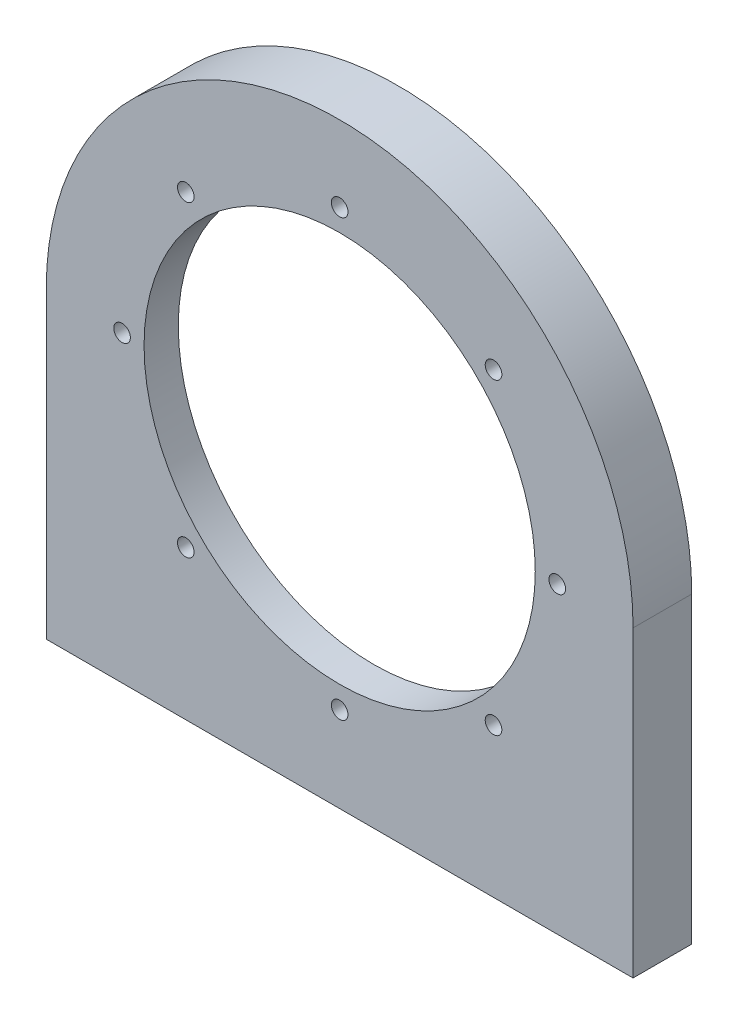
ISO-10303-21;
HEADER;
FILE_DESCRIPTION(('STEP AP214'),'2;1');
FILE_NAME('part.step','',(''),(''),'','','');
FILE_SCHEMA(('AUTOMOTIVE_DESIGN { 1 0 10303 214 1 1 1 1 }'));
ENDSEC;
DATA;
#1=APPLICATION_CONTEXT('core data for automotive mechanical design processes');
#2=APPLICATION_PROTOCOL_DEFINITION('international standard','automotive_design',2000,#1);
#3=PRODUCT_CONTEXT('',#1,'mechanical');
#4=PRODUCT('Part','Part','',(#3));
#5=PRODUCT_RELATED_PRODUCT_CATEGORY('part','',(#4));
#6=PRODUCT_DEFINITION_FORMATION('','',#4);
#7=PRODUCT_DEFINITION_CONTEXT('part definition',#1,'design');
#8=PRODUCT_DEFINITION('design','',#6,#7);
#9=PRODUCT_DEFINITION_SHAPE('','',#8);
#10=(LENGTH_UNIT() NAMED_UNIT(*) SI_UNIT(.MILLI.,.METRE.));
#11=(NAMED_UNIT(*) PLANE_ANGLE_UNIT() SI_UNIT($,.RADIAN.));
#12=(NAMED_UNIT(*) SI_UNIT($,.STERADIAN.) SOLID_ANGLE_UNIT());
#13=UNCERTAINTY_MEASURE_WITH_UNIT(LENGTH_MEASURE(1.E-05),#10,'distance_accuracy_value','');
#14=(GEOMETRIC_REPRESENTATION_CONTEXT(3) GLOBAL_UNCERTAINTY_ASSIGNED_CONTEXT((#13)) GLOBAL_UNIT_ASSIGNED_CONTEXT((#10,
#11,#12)) REPRESENTATION_CONTEXT('',''));
#15=CARTESIAN_POINT('',(0.,0.,0.));
#16=DIRECTION('',(0.,0.,1.));
#17=DIRECTION('',(1.,0.,0.));
#18=AXIS2_PLACEMENT_3D('',#15,#16,#17);
#19=CARTESIAN_POINT('',(0.,0.,7.));
#20=DIRECTION('',(0.,0.,-1.));
#21=DIRECTION('',(-1.,0.,0.));
#22=AXIS2_PLACEMENT_3D('',#19,#20,#21);
#23=CYLINDRICAL_SURFACE('',#22,60.);
#24=DIRECTION('',(0.,0.,1.));
#25=VECTOR('',#24,1.);
#26=CARTESIAN_POINT('',(-60.,0.,-140.070352039224));
#27=LINE('',#26,#25);
#28=CARTESIAN_POINT('',(-60.,0.,-5.));
#29=VERTEX_POINT('',#28);
#30=CARTESIAN_POINT('',(-60.,0.,7.));
#31=VERTEX_POINT('',#30);
#32=EDGE_CURVE('E60',#29,#31,#27,.T.);
#33=ORIENTED_EDGE('',*,*,#32,.T.);
#34=CARTESIAN_POINT('',(0.,0.,7.));
#35=DIRECTION('',(0.,0.,1.));
#36=DIRECTION('',(1.,0.,0.));
#37=AXIS2_PLACEMENT_3D('',#34,#35,#36);
#38=CIRCLE('',#37,60.);
#39=CARTESIAN_POINT('',(60.,0.,7.));
#40=VERTEX_POINT('',#39);
#41=EDGE_CURVE('E11',#40,#31,#38,.T.);
#42=ORIENTED_EDGE('',*,*,#41,.F.);
#43=DIRECTION('',(0.,0.,1.));
#44=VECTOR('',#43,1.);
#45=CARTESIAN_POINT('',(60.,0.,-140.070352039224));
#46=LINE('',#45,#44);
#47=CARTESIAN_POINT('',(60.,0.,-5.));
#48=VERTEX_POINT('',#47);
#49=EDGE_CURVE('E112',#48,#40,#46,.T.);
#50=ORIENTED_EDGE('',*,*,#49,.F.);
#51=CARTESIAN_POINT('',(0.,0.,-5.));
#52=DIRECTION('',(0.,0.,-1.));
#53=DIRECTION('',(-1.,0.,0.));
#54=AXIS2_PLACEMENT_3D('',#51,#52,#53);
#55=CIRCLE('',#54,60.);
#56=EDGE_CURVE('E140',#29,#48,#55,.T.);
#57=ORIENTED_EDGE('',*,*,#56,.F.);
#58=EDGE_LOOP('',(#33,#42,#50,#57));
#59=FACE_BOUND('',#58,.T.);
#60=ADVANCED_FACE('F45',(#59),#23,.T.);
#61=CARTESIAN_POINT('',(0.,0.,0.));
#62=DIRECTION('',(0.,0.,1.));
#63=DIRECTION('',(1.,0.,0.));
#64=AXIS2_PLACEMENT_3D('',#61,#62,#63);
#65=PLANE('',#64);
#66=CARTESIAN_POINT('',(0.,0.,0.));
#67=DIRECTION('',(0.,0.,1.));
#68=DIRECTION('',(1.,0.,0.));
#69=AXIS2_PLACEMENT_3D('',#66,#67,#68);
#70=CIRCLE('',#69,40.);
#71=CARTESIAN_POINT('',(40.,0.,0.));
#72=VERTEX_POINT('',#71);
#73=EDGE_CURVE('E210',#72,#72,#70,.T.);
#74=ORIENTED_EDGE('',*,*,#73,.T.);
#75=EDGE_LOOP('',(#74));
#76=FACE_BOUND('',#75,.T.);
#77=CARTESIAN_POINT('',(-31.4662517628008,31.4662517628,0.));
#78=DIRECTION('',(0.,0.,1.));
#79=DIRECTION('',(1.,0.,0.));
#80=AXIS2_PLACEMENT_3D('',#77,#78,#79);
#81=CIRCLE('',#80,1.7);
#82=CARTESIAN_POINT('',(-29.7662517628008,31.4662517628,0.));
#83=VERTEX_POINT('',#82);
#84=EDGE_CURVE('E206',#83,#83,#81,.T.);
#85=ORIENTED_EDGE('',*,*,#84,.T.);
#86=EDGE_LOOP('',(#85));
#87=FACE_BOUND('',#86,.T.);
#88=CARTESIAN_POINT('',(-44.4999999999981,-1.89442426535137E-12,0.));
#89=DIRECTION('',(0.,0.,1.));
#90=DIRECTION('',(1.,0.,0.));
#91=AXIS2_PLACEMENT_3D('',#88,#89,#90);
#92=CIRCLE('',#91,1.7);
#93=CARTESIAN_POINT('',(-42.7999999999981,-1.89442426535137E-12,0.));
#94=VERTEX_POINT('',#93);
#95=EDGE_CURVE('E198',#94,#94,#92,.T.);
#96=ORIENTED_EDGE('',*,*,#95,.T.);
#97=EDGE_LOOP('',(#96));
#98=FACE_BOUND('',#97,.T.);
#99=CARTESIAN_POINT('',(-31.4662517627981,-31.4662517628027,0.));
#100=DIRECTION('',(0.,0.,1.));
#101=DIRECTION('',(1.,0.,0.));
#102=AXIS2_PLACEMENT_3D('',#99,#100,#101);
#103=CIRCLE('',#102,1.7);
#104=CARTESIAN_POINT('',(-29.7662517627981,-31.4662517628027,0.));
#105=VERTEX_POINT('',#104);
#106=EDGE_CURVE('E190',#105,#105,#103,.T.);
#107=ORIENTED_EDGE('',*,*,#106,.T.);
#108=EDGE_LOOP('',(#107));
#109=FACE_BOUND('',#108,.T.);
#110=CARTESIAN_POINT('',(3.77794917419032E-12,-44.5,0.));
#111=DIRECTION('',(0.,0.,1.));
#112=DIRECTION('',(1.,0.,0.));
#113=AXIS2_PLACEMENT_3D('',#110,#111,#112);
#114=CIRCLE('',#113,1.7);
#115=CARTESIAN_POINT('',(1.70000000000378,-44.5,0.));
#116=VERTEX_POINT('',#115);
#117=EDGE_CURVE('E182',#116,#116,#114,.T.);
#118=ORIENTED_EDGE('',*,*,#117,.T.);
#119=EDGE_LOOP('',(#118));
#120=FACE_BOUND('',#119,.T.);
#121=CARTESIAN_POINT('',(31.4662517628046,-31.4662517628,0.));
#122=DIRECTION('',(0.,0.,1.));
#123=DIRECTION('',(1.,0.,0.));
#124=AXIS2_PLACEMENT_3D('',#121,#122,#123);
#125=CIRCLE('',#124,1.7);
#126=CARTESIAN_POINT('',(33.1662517628046,-31.4662517628,0.));
#127=VERTEX_POINT('',#126);
#128=EDGE_CURVE('E174',#127,#127,#125,.T.);
#129=ORIENTED_EDGE('',*,*,#128,.T.);
#130=EDGE_LOOP('',(#129));
#131=FACE_BOUND('',#130,.T.);
#132=CARTESIAN_POINT('',(44.5000000000019,1.88897458709516E-12,0.));
#133=DIRECTION('',(0.,0.,1.));
#134=DIRECTION('',(1.,0.,0.));
#135=AXIS2_PLACEMENT_3D('',#132,#133,#134);
#136=CIRCLE('',#135,1.7);
#137=CARTESIAN_POINT('',(46.2000000000019,1.88897458709516E-12,0.));
#138=VERTEX_POINT('',#137);
#139=EDGE_CURVE('E166',#138,#138,#136,.T.);
#140=ORIENTED_EDGE('',*,*,#139,.T.);
#141=EDGE_LOOP('',(#140));
#142=FACE_BOUND('',#141,.T.);
#143=CARTESIAN_POINT('',(31.4662517628019,31.4662517628027,0.));
#144=DIRECTION('',(0.,0.,1.));
#145=DIRECTION('',(1.,0.,0.));
#146=AXIS2_PLACEMENT_3D('',#143,#144,#145);
#147=CIRCLE('',#146,1.7);
#148=CARTESIAN_POINT('',(33.1662517628019,31.4662517628027,0.));
#149=VERTEX_POINT('',#148);
#150=EDGE_CURVE('E158',#149,#149,#147,.T.);
#151=ORIENTED_EDGE('',*,*,#150,.T.);
#152=EDGE_LOOP('',(#151));
#153=FACE_BOUND('',#152,.T.);
#154=CARTESIAN_POINT('',(0.,44.5,0.));
#155=DIRECTION('',(0.,0.,1.));
#156=DIRECTION('',(1.,0.,0.));
#157=AXIS2_PLACEMENT_3D('',#154,#155,#156);
#158=CIRCLE('',#157,1.7);
#159=CARTESIAN_POINT('',(1.7,44.5,0.));
#160=VERTEX_POINT('',#159);
#161=EDGE_CURVE('E150',#160,#160,#158,.T.);
#162=ORIENTED_EDGE('',*,*,#161,.T.);
#163=EDGE_LOOP('',(#162));
#164=FACE_BOUND('',#163,.T.);
#165=CARTESIAN_POINT('',(0.,0.,0.));
#166=DIRECTION('',(0.,0.,-1.));
#167=DIRECTION('',(-1.,0.,0.));
#168=AXIS2_PLACEMENT_3D('',#165,#166,#167);
#169=CIRCLE('',#168,50.);
#170=CARTESIAN_POINT('',(-50.,0.,0.));
#171=VERTEX_POINT('',#170);
#172=EDGE_CURVE('E135',#171,#171,#169,.T.);
#173=ORIENTED_EDGE('',*,*,#172,.T.);
#174=EDGE_LOOP('',(#173));
#175=FACE_BOUND('',#174,.T.);
#176=ADVANCED_FACE('F217',(#76,#87,#98,#109,#120,#131,#142,#153,#164,#175),#65,.F.);
#177=CARTESIAN_POINT('',(0.,0.,7.));
#178=DIRECTION('',(0.,0.,1.));
#179=DIRECTION('',(1.,0.,0.));
#180=AXIS2_PLACEMENT_3D('',#177,#178,#179);
#181=PLANE('',#180);
#182=CARTESIAN_POINT('',(0.,44.5,7.));
#183=DIRECTION('',(0.,0.,1.));
#184=DIRECTION('',(1.,0.,0.));
#185=AXIS2_PLACEMENT_3D('',#182,#183,#184);
#186=CIRCLE('',#185,1.7);
#187=CARTESIAN_POINT('',(1.7,44.5,7.));
#188=VERTEX_POINT('',#187);
#189=EDGE_CURVE('E146',#188,#188,#186,.T.);
#190=ORIENTED_EDGE('',*,*,#189,.F.);
#191=EDGE_LOOP('',(#190));
#192=FACE_BOUND('',#191,.T.);
#193=CARTESIAN_POINT('',(31.4662517628019,31.4662517628027,7.));
#194=DIRECTION('',(0.,0.,1.));
#195=DIRECTION('',(1.,0.,0.));
#196=AXIS2_PLACEMENT_3D('',#193,#194,#195);
#197=CIRCLE('',#196,1.7);
#198=CARTESIAN_POINT('',(33.1662517628019,31.4662517628027,7.));
#199=VERTEX_POINT('',#198);
#200=EDGE_CURVE('E154',#199,#199,#197,.T.);
#201=ORIENTED_EDGE('',*,*,#200,.F.);
#202=EDGE_LOOP('',(#201));
#203=FACE_BOUND('',#202,.T.);
#204=CARTESIAN_POINT('',(44.5000000000019,1.88897458709516E-12,7.));
#205=DIRECTION('',(0.,0.,1.));
#206=DIRECTION('',(1.,0.,0.));
#207=AXIS2_PLACEMENT_3D('',#204,#205,#206);
#208=CIRCLE('',#207,1.7);
#209=CARTESIAN_POINT('',(46.2000000000019,1.88897458709516E-12,7.));
#210=VERTEX_POINT('',#209);
#211=EDGE_CURVE('E162',#210,#210,#208,.T.);
#212=ORIENTED_EDGE('',*,*,#211,.F.);
#213=EDGE_LOOP('',(#212));
#214=FACE_BOUND('',#213,.T.);
#215=CARTESIAN_POINT('',(31.4662517628046,-31.4662517628,7.));
#216=DIRECTION('',(0.,0.,1.));
#217=DIRECTION('',(1.,0.,0.));
#218=AXIS2_PLACEMENT_3D('',#215,#216,#217);
#219=CIRCLE('',#218,1.7);
#220=CARTESIAN_POINT('',(33.1662517628046,-31.4662517628,7.));
#221=VERTEX_POINT('',#220);
#222=EDGE_CURVE('E170',#221,#221,#219,.T.);
#223=ORIENTED_EDGE('',*,*,#222,.F.);
#224=EDGE_LOOP('',(#223));
#225=FACE_BOUND('',#224,.T.);
#226=CARTESIAN_POINT('',(3.77794917419032E-12,-44.5,7.));
#227=DIRECTION('',(0.,0.,1.));
#228=DIRECTION('',(1.,0.,0.));
#229=AXIS2_PLACEMENT_3D('',#226,#227,#228);
#230=CIRCLE('',#229,1.7);
#231=CARTESIAN_POINT('',(1.70000000000378,-44.5,7.));
#232=VERTEX_POINT('',#231);
#233=EDGE_CURVE('E178',#232,#232,#230,.T.);
#234=ORIENTED_EDGE('',*,*,#233,.F.);
#235=EDGE_LOOP('',(#234));
#236=FACE_BOUND('',#235,.T.);
#237=CARTESIAN_POINT('',(-31.4662517627981,-31.4662517628027,7.));
#238=DIRECTION('',(0.,0.,1.));
#239=DIRECTION('',(1.,0.,0.));
#240=AXIS2_PLACEMENT_3D('',#237,#238,#239);
#241=CIRCLE('',#240,1.7);
#242=CARTESIAN_POINT('',(-29.7662517627981,-31.4662517628027,7.));
#243=VERTEX_POINT('',#242);
#244=EDGE_CURVE('E186',#243,#243,#241,.T.);
#245=ORIENTED_EDGE('',*,*,#244,.F.);
#246=EDGE_LOOP('',(#245));
#247=FACE_BOUND('',#246,.T.);
#248=CARTESIAN_POINT('',(-44.4999999999981,-1.89442426535137E-12,7.));
#249=DIRECTION('',(0.,0.,1.));
#250=DIRECTION('',(1.,0.,0.));
#251=AXIS2_PLACEMENT_3D('',#248,#249,#250);
#252=CIRCLE('',#251,1.7);
#253=CARTESIAN_POINT('',(-42.7999999999981,-1.89442426535137E-12,7.));
#254=VERTEX_POINT('',#253);
#255=EDGE_CURVE('E194',#254,#254,#252,.T.);
#256=ORIENTED_EDGE('',*,*,#255,.F.);
#257=EDGE_LOOP('',(#256));
#258=FACE_BOUND('',#257,.T.);
#259=CARTESIAN_POINT('',(-31.4662517628008,31.4662517628,7.));
#260=DIRECTION('',(0.,0.,1.));
#261=DIRECTION('',(1.,0.,0.));
#262=AXIS2_PLACEMENT_3D('',#259,#260,#261);
#263=CIRCLE('',#262,1.7);
#264=CARTESIAN_POINT('',(-29.7662517628008,31.4662517628,7.));
#265=VERTEX_POINT('',#264);
#266=EDGE_CURVE('E202',#265,#265,#263,.T.);
#267=ORIENTED_EDGE('',*,*,#266,.F.);
#268=EDGE_LOOP('',(#267));
#269=FACE_BOUND('',#268,.T.);
#270=ORIENTED_EDGE('',*,*,#41,.T.);
#271=DIRECTION('',(0.,-1.,0.));
#272=VECTOR('',#271,1.);
#273=CARTESIAN_POINT('',(-60.,0.,7.));
#274=LINE('',#273,#272);
#275=CARTESIAN_POINT('',(-60.,-62.,7.));
#276=VERTEX_POINT('',#275);
#277=EDGE_CURVE('E66',#31,#276,#274,.T.);
#278=ORIENTED_EDGE('',*,*,#277,.T.);
#279=DIRECTION('',(1.,0.,0.));
#280=VECTOR('',#279,1.);
#281=CARTESIAN_POINT('',(-60.,-62.,7.));
#282=LINE('',#281,#280);
#283=CARTESIAN_POINT('',(60.,-62.,7.));
#284=VERTEX_POINT('',#283);
#285=EDGE_CURVE('E97',#276,#284,#282,.T.);
#286=ORIENTED_EDGE('',*,*,#285,.T.);
#287=DIRECTION('',(0.,1.,0.));
#288=VECTOR('',#287,1.);
#289=CARTESIAN_POINT('',(60.,-62.,7.));
#290=LINE('',#289,#288);
#291=EDGE_CURVE('E106',#284,#40,#290,.T.);
#292=ORIENTED_EDGE('',*,*,#291,.T.);
#293=EDGE_LOOP('',(#270,#278,#286,#292));
#294=FACE_BOUND('',#293,.T.);
#295=CARTESIAN_POINT('',(0.,0.,7.));
#296=DIRECTION('',(0.,0.,1.));
#297=DIRECTION('',(1.,0.,0.));
#298=AXIS2_PLACEMENT_3D('',#295,#296,#297);
#299=CIRCLE('',#298,40.);
#300=CARTESIAN_POINT('',(40.,0.,7.));
#301=VERTEX_POINT('',#300);
#302=EDGE_CURVE('E53',#301,#301,#299,.T.);
#303=ORIENTED_EDGE('',*,*,#302,.F.);
#304=EDGE_LOOP('',(#303));
#305=FACE_BOUND('',#304,.T.);
#306=ADVANCED_FACE('F104',(#192,#203,#214,#225,#236,#247,#258,#269,#294,#305),#181,.T.);
#307=CARTESIAN_POINT('',(0.,0.,7.));
#308=DIRECTION('',(0.,0.,-1.));
#309=DIRECTION('',(-1.,0.,0.));
#310=AXIS2_PLACEMENT_3D('',#307,#308,#309);
#311=CYLINDRICAL_SURFACE('',#310,40.);
#312=ORIENTED_EDGE('',*,*,#302,.T.);
#313=EDGE_LOOP('',(#312));
#314=FACE_BOUND('',#313,.T.);
#315=ORIENTED_EDGE('',*,*,#73,.F.);
#316=EDGE_LOOP('',(#315));
#317=FACE_BOUND('',#316,.T.);
#318=ADVANCED_FACE('F220',(#314,#317),#311,.F.);
#319=CARTESIAN_POINT('',(-31.4662517628008,31.4662517628,7.));
#320=DIRECTION('',(0.,0.,1.));
#321=DIRECTION('',(1.,0.,0.));
#322=AXIS2_PLACEMENT_3D('',#319,#320,#321);
#323=CYLINDRICAL_SURFACE('',#322,1.7);
#324=ORIENTED_EDGE('',*,*,#84,.F.);
#325=EDGE_LOOP('',(#324));
#326=FACE_BOUND('',#325,.T.);
#327=ORIENTED_EDGE('',*,*,#266,.T.);
#328=EDGE_LOOP('',(#327));
#329=FACE_BOUND('',#328,.T.);
#330=ADVANCED_FACE('F222',(#326,#329),#323,.F.);
#331=CARTESIAN_POINT('',(-44.4999999999981,-1.89442426535137E-12,7.));
#332=DIRECTION('',(0.,0.,1.));
#333=DIRECTION('',(1.,0.,0.));
#334=AXIS2_PLACEMENT_3D('',#331,#332,#333);
#335=CYLINDRICAL_SURFACE('',#334,1.7);
#336=ORIENTED_EDGE('',*,*,#95,.F.);
#337=EDGE_LOOP('',(#336));
#338=FACE_BOUND('',#337,.T.);
#339=ORIENTED_EDGE('',*,*,#255,.T.);
#340=EDGE_LOOP('',(#339));
#341=FACE_BOUND('',#340,.T.);
#342=ADVANCED_FACE('F228',(#338,#341),#335,.F.);
#343=CARTESIAN_POINT('',(-31.4662517627981,-31.4662517628027,7.));
#344=DIRECTION('',(0.,0.,1.));
#345=DIRECTION('',(1.,0.,0.));
#346=AXIS2_PLACEMENT_3D('',#343,#344,#345);
#347=CYLINDRICAL_SURFACE('',#346,1.7);
#348=ORIENTED_EDGE('',*,*,#106,.F.);
#349=EDGE_LOOP('',(#348));
#350=FACE_BOUND('',#349,.T.);
#351=ORIENTED_EDGE('',*,*,#244,.T.);
#352=EDGE_LOOP('',(#351));
#353=FACE_BOUND('',#352,.T.);
#354=ADVANCED_FACE('F278',(#350,#353),#347,.F.);
#355=CARTESIAN_POINT('',(3.77794917419032E-12,-44.5,7.));
#356=DIRECTION('',(0.,0.,1.));
#357=DIRECTION('',(1.,0.,0.));
#358=AXIS2_PLACEMENT_3D('',#355,#356,#357);
#359=CYLINDRICAL_SURFACE('',#358,1.7);
#360=ORIENTED_EDGE('',*,*,#117,.F.);
#361=EDGE_LOOP('',(#360));
#362=FACE_BOUND('',#361,.T.);
#363=ORIENTED_EDGE('',*,*,#233,.T.);
#364=EDGE_LOOP('',(#363));
#365=FACE_BOUND('',#364,.T.);
#366=ADVANCED_FACE('F274',(#362,#365),#359,.F.);
#367=CARTESIAN_POINT('',(31.4662517628046,-31.4662517628,7.));
#368=DIRECTION('',(0.,0.,1.));
#369=DIRECTION('',(1.,0.,0.));
#370=AXIS2_PLACEMENT_3D('',#367,#368,#369);
#371=CYLINDRICAL_SURFACE('',#370,1.7);
#372=ORIENTED_EDGE('',*,*,#128,.F.);
#373=EDGE_LOOP('',(#372));
#374=FACE_BOUND('',#373,.T.);
#375=ORIENTED_EDGE('',*,*,#222,.T.);
#376=EDGE_LOOP('',(#375));
#377=FACE_BOUND('',#376,.T.);
#378=ADVANCED_FACE('F270',(#374,#377),#371,.F.);
#379=CARTESIAN_POINT('',(44.5000000000019,1.88897458709516E-12,7.));
#380=DIRECTION('',(0.,0.,1.));
#381=DIRECTION('',(1.,0.,0.));
#382=AXIS2_PLACEMENT_3D('',#379,#380,#381);
#383=CYLINDRICAL_SURFACE('',#382,1.7);
#384=ORIENTED_EDGE('',*,*,#139,.F.);
#385=EDGE_LOOP('',(#384));
#386=FACE_BOUND('',#385,.T.);
#387=ORIENTED_EDGE('',*,*,#211,.T.);
#388=EDGE_LOOP('',(#387));
#389=FACE_BOUND('',#388,.T.);
#390=ADVANCED_FACE('F266',(#386,#389),#383,.F.);
#391=CARTESIAN_POINT('',(31.4662517628019,31.4662517628027,7.));
#392=DIRECTION('',(0.,0.,1.));
#393=DIRECTION('',(1.,0.,0.));
#394=AXIS2_PLACEMENT_3D('',#391,#392,#393);
#395=CYLINDRICAL_SURFACE('',#394,1.7);
#396=ORIENTED_EDGE('',*,*,#150,.F.);
#397=EDGE_LOOP('',(#396));
#398=FACE_BOUND('',#397,.T.);
#399=ORIENTED_EDGE('',*,*,#200,.T.);
#400=EDGE_LOOP('',(#399));
#401=FACE_BOUND('',#400,.T.);
#402=ADVANCED_FACE('F262',(#398,#401),#395,.F.);
#403=CARTESIAN_POINT('',(0.,44.5,7.));
#404=DIRECTION('',(0.,0.,1.));
#405=DIRECTION('',(1.,0.,0.));
#406=AXIS2_PLACEMENT_3D('',#403,#404,#405);
#407=CYLINDRICAL_SURFACE('',#406,1.7);
#408=ORIENTED_EDGE('',*,*,#161,.F.);
#409=EDGE_LOOP('',(#408));
#410=FACE_BOUND('',#409,.T.);
#411=ORIENTED_EDGE('',*,*,#189,.T.);
#412=EDGE_LOOP('',(#411));
#413=FACE_BOUND('',#412,.T.);
#414=ADVANCED_FACE('F259',(#410,#413),#407,.F.);
#415=CARTESIAN_POINT('',(0.,0.,-5.));
#416=DIRECTION('',(0.,0.,-1.));
#417=DIRECTION('',(-1.,0.,0.));
#418=AXIS2_PLACEMENT_3D('',#415,#416,#417);
#419=PLANE('',#418);
#420=ORIENTED_EDGE('',*,*,#56,.T.);
#421=DIRECTION('',(0.,1.,0.));
#422=VECTOR('',#421,1.);
#423=CARTESIAN_POINT('',(60.,-62.,-5.));
#424=LINE('',#423,#422);
#425=CARTESIAN_POINT('',(60.,-62.,-5.));
#426=VERTEX_POINT('',#425);
#427=EDGE_CURVE('E83',#426,#48,#424,.T.);
#428=ORIENTED_EDGE('',*,*,#427,.F.);
#429=DIRECTION('',(1.,0.,0.));
#430=VECTOR('',#429,1.);
#431=CARTESIAN_POINT('',(-60.,-62.,-5.));
#432=LINE('',#431,#430);
#433=CARTESIAN_POINT('',(-60.,-62.,-5.));
#434=VERTEX_POINT('',#433);
#435=EDGE_CURVE('E87',#434,#426,#432,.T.);
#436=ORIENTED_EDGE('',*,*,#435,.F.);
#437=DIRECTION('',(0.,-1.,0.));
#438=VECTOR('',#437,1.);
#439=CARTESIAN_POINT('',(-60.,0.,-5.));
#440=LINE('',#439,#438);
#441=EDGE_CURVE('E114',#29,#434,#440,.T.);
#442=ORIENTED_EDGE('',*,*,#441,.F.);
#443=EDGE_LOOP('',(#420,#428,#436,#442));
#444=FACE_BOUND('',#443,.T.);
#445=CARTESIAN_POINT('',(0.,0.,-5.));
#446=DIRECTION('',(0.,0.,-1.));
#447=DIRECTION('',(-1.,0.,0.));
#448=AXIS2_PLACEMENT_3D('',#445,#446,#447);
#449=CIRCLE('',#448,50.);
#450=CARTESIAN_POINT('',(-50.,0.,-5.));
#451=VERTEX_POINT('',#450);
#452=EDGE_CURVE('E136',#451,#451,#449,.T.);
#453=ORIENTED_EDGE('',*,*,#452,.F.);
#454=EDGE_LOOP('',(#453));
#455=FACE_BOUND('',#454,.T.);
#456=ADVANCED_FACE('F241',(#444,#455),#419,.T.);
#457=CARTESIAN_POINT('',(0.,0.,-5.));
#458=DIRECTION('',(0.,0.,1.));
#459=DIRECTION('',(1.,0.,0.));
#460=AXIS2_PLACEMENT_3D('',#457,#458,#459);
#461=CYLINDRICAL_SURFACE('',#460,50.);
#462=ORIENTED_EDGE('',*,*,#452,.T.);
#463=EDGE_LOOP('',(#462));
#464=FACE_BOUND('',#463,.T.);
#465=ORIENTED_EDGE('',*,*,#172,.F.);
#466=EDGE_LOOP('',(#465));
#467=FACE_BOUND('',#466,.T.);
#468=ADVANCED_FACE('F245',(#464,#467),#461,.F.);
#469=CARTESIAN_POINT('',(-60.,0.,-140.070352039224));
#470=DIRECTION('',(-1.,0.,0.));
#471=DIRECTION('',(0.,-1.,0.));
#472=AXIS2_PLACEMENT_3D('',#469,#470,#471);
#473=PLANE('',#472);
#474=ORIENTED_EDGE('',*,*,#32,.F.);
#475=ORIENTED_EDGE('',*,*,#441,.T.);
#476=DIRECTION('',(0.,0.,1.));
#477=VECTOR('',#476,1.);
#478=CARTESIAN_POINT('',(-60.,-62.,-140.070352039224));
#479=LINE('',#478,#477);
#480=EDGE_CURVE('E117',#434,#276,#479,.T.);
#481=ORIENTED_EDGE('',*,*,#480,.T.);
#482=ORIENTED_EDGE('',*,*,#277,.F.);
#483=EDGE_LOOP('',(#474,#475,#481,#482));
#484=FACE_BOUND('',#483,.T.);
#485=ADVANCED_FACE('F243',(#484),#473,.T.);
#486=CARTESIAN_POINT('',(-60.,-62.,-140.070352039224));
#487=DIRECTION('',(0.,-1.,0.));
#488=DIRECTION('',(0.,0.,-1.));
#489=AXIS2_PLACEMENT_3D('',#486,#487,#488);
#490=PLANE('',#489);
#491=CARTESIAN_POINT('',(-50.,-62.,0.999999999999997));
#492=DIRECTION('',(0.,-1.,0.));
#493=DIRECTION('',(0.,0.,-1.));
#494=AXIS2_PLACEMENT_3D('',#491,#492,#493);
#495=CIRCLE('',#494,1.64999999999999);
#496=CARTESIAN_POINT('',(-50.,-62.,-0.649999999999994));
#497=VERTEX_POINT('',#496);
#498=EDGE_CURVE('E517',#497,#497,#495,.T.);
#499=ORIENTED_EDGE('',*,*,#498,.F.);
#500=EDGE_LOOP('',(#499));
#501=FACE_BOUND('',#500,.T.);
#502=CARTESIAN_POINT('',(-25.,-62.,0.999999999999997));
#503=DIRECTION('',(0.,-1.,0.));
#504=DIRECTION('',(0.,0.,-1.));
#505=AXIS2_PLACEMENT_3D('',#502,#503,#504);
#506=CIRCLE('',#505,1.64999999999999);
#507=CARTESIAN_POINT('',(-25.,-62.,-0.649999999999994));
#508=VERTEX_POINT('',#507);
#509=EDGE_CURVE('E521',#508,#508,#506,.T.);
#510=ORIENTED_EDGE('',*,*,#509,.F.);
#511=EDGE_LOOP('',(#510));
#512=FACE_BOUND('',#511,.T.);
#513=CARTESIAN_POINT('',(0.,-62.,0.999999999999997));
#514=DIRECTION('',(0.,-1.,0.));
#515=DIRECTION('',(0.,0.,-1.));
#516=AXIS2_PLACEMENT_3D('',#513,#514,#515);
#517=CIRCLE('',#516,1.64999999999999);
#518=CARTESIAN_POINT('',(0.,-62.,-0.649999999999993));
#519=VERTEX_POINT('',#518);
#520=EDGE_CURVE('E531',#519,#519,#517,.T.);
#521=ORIENTED_EDGE('',*,*,#520,.F.);
#522=EDGE_LOOP('',(#521));
#523=FACE_BOUND('',#522,.T.);
#524=CARTESIAN_POINT('',(25.,-62.,0.999999999999997));
#525=DIRECTION('',(0.,-1.,0.));
#526=DIRECTION('',(0.,0.,-1.));
#527=AXIS2_PLACEMENT_3D('',#524,#525,#526);
#528=CIRCLE('',#527,1.64999999999999);
#529=CARTESIAN_POINT('',(25.,-62.,-0.649999999999994));
#530=VERTEX_POINT('',#529);
#531=EDGE_CURVE('E539',#530,#530,#528,.T.);
#532=ORIENTED_EDGE('',*,*,#531,.F.);
#533=EDGE_LOOP('',(#532));
#534=FACE_BOUND('',#533,.T.);
#535=CARTESIAN_POINT('',(50.,-62.,0.999999999999997));
#536=DIRECTION('',(0.,-1.,0.));
#537=DIRECTION('',(0.,0.,-1.));
#538=AXIS2_PLACEMENT_3D('',#535,#536,#537);
#539=CIRCLE('',#538,1.64999999999999);
#540=CARTESIAN_POINT('',(50.,-62.,-0.649999999999994));
#541=VERTEX_POINT('',#540);
#542=EDGE_CURVE('E546',#541,#541,#539,.T.);
#543=ORIENTED_EDGE('',*,*,#542,.F.);
#544=EDGE_LOOP('',(#543));
#545=FACE_BOUND('',#544,.T.);
#546=ORIENTED_EDGE('',*,*,#480,.F.);
#547=ORIENTED_EDGE('',*,*,#435,.T.);
#548=DIRECTION('',(0.,0.,1.));
#549=VECTOR('',#548,1.);
#550=CARTESIAN_POINT('',(60.,-62.,-140.070352039224));
#551=LINE('',#550,#549);
#552=EDGE_CURVE('E94',#426,#284,#551,.T.);
#553=ORIENTED_EDGE('',*,*,#552,.T.);
#554=ORIENTED_EDGE('',*,*,#285,.F.);
#555=EDGE_LOOP('',(#546,#547,#553,#554));
#556=FACE_BOUND('',#555,.T.);
#557=ADVANCED_FACE('F96',(#501,#512,#523,#534,#545,#556),#490,.T.);
#558=CARTESIAN_POINT('',(60.,-62.,-140.070352039224));
#559=DIRECTION('',(1.,0.,0.));
#560=DIRECTION('',(0.,0.,-1.));
#561=AXIS2_PLACEMENT_3D('',#558,#559,#560);
#562=PLANE('',#561);
#563=ORIENTED_EDGE('',*,*,#552,.F.);
#564=ORIENTED_EDGE('',*,*,#427,.T.);
#565=ORIENTED_EDGE('',*,*,#49,.T.);
#566=ORIENTED_EDGE('',*,*,#291,.F.);
#567=EDGE_LOOP('',(#563,#564,#565,#566));
#568=FACE_BOUND('',#567,.T.);
#569=ADVANCED_FACE('F110',(#568),#562,.T.);
#570=CARTESIAN_POINT('',(50.,-52.,0.999999999999997));
#571=DIRECTION('',(0.,-1.,0.));
#572=DIRECTION('',(0.,0.,-1.));
#573=AXIS2_PLACEMENT_3D('',#570,#571,#572);
#574=CONICAL_SURFACE('',#573,1.64999999999998,1.02974425867665);
#575=CARTESIAN_POINT('',(50.,-51.0085799786045,0.999999999999997));
#576=VERTEX_POINT('',#575);
#577=VERTEX_LOOP('',#576);
#578=FACE_BOUND('',#577,.T.);
#579=CARTESIAN_POINT('',(50.,-52.,0.999999999999997));
#580=DIRECTION('',(0.,-1.,0.));
#581=DIRECTION('',(0.,0.,-1.));
#582=AXIS2_PLACEMENT_3D('',#579,#580,#581);
#583=CIRCLE('',#582,1.64999999999998);
#584=CARTESIAN_POINT('',(50.,-52.,-0.649999999999987));
#585=VERTEX_POINT('',#584);
#586=EDGE_CURVE('E120',#585,#585,#583,.T.);
#587=ORIENTED_EDGE('',*,*,#586,.T.);
#588=EDGE_LOOP('',(#587));
#589=FACE_BOUND('',#588,.T.);
#590=ADVANCED_FACE('F411',(#578,#589),#574,.F.);
#591=CARTESIAN_POINT('',(50.,-62.,0.999999999999997));
#592=DIRECTION('',(0.,-1.,0.));
#593=DIRECTION('',(0.,0.,-1.));
#594=AXIS2_PLACEMENT_3D('',#591,#592,#593);
#595=CYLINDRICAL_SURFACE('',#594,1.64999999999999);
#596=ORIENTED_EDGE('',*,*,#586,.F.);
#597=EDGE_LOOP('',(#596));
#598=FACE_BOUND('',#597,.T.);
#599=ORIENTED_EDGE('',*,*,#542,.T.);
#600=EDGE_LOOP('',(#599));
#601=FACE_BOUND('',#600,.T.);
#602=ADVANCED_FACE('F418',(#598,#601),#595,.F.);
#603=CARTESIAN_POINT('',(25.,-52.,0.999999999999997));
#604=DIRECTION('',(0.,-1.,0.));
#605=DIRECTION('',(0.,0.,-1.));
#606=AXIS2_PLACEMENT_3D('',#603,#604,#605);
#607=CONICAL_SURFACE('',#606,1.64999999999998,1.02974425867665);
#608=CARTESIAN_POINT('',(25.,-51.0085799786045,0.999999999999997));
#609=VERTEX_POINT('',#608);
#610=VERTEX_LOOP('',#609);
#611=FACE_BOUND('',#610,.T.);
#612=CARTESIAN_POINT('',(25.,-52.,0.999999999999997));
#613=DIRECTION('',(0.,-1.,0.));
#614=DIRECTION('',(0.,0.,-1.));
#615=AXIS2_PLACEMENT_3D('',#612,#613,#614);
#616=CIRCLE('',#615,1.64999999999998);
#617=CARTESIAN_POINT('',(25.,-52.,-0.649999999999987));
#618=VERTEX_POINT('',#617);
#619=EDGE_CURVE('E543',#618,#618,#616,.T.);
#620=ORIENTED_EDGE('',*,*,#619,.T.);
#621=EDGE_LOOP('',(#620));
#622=FACE_BOUND('',#621,.T.);
#623=ADVANCED_FACE('F428',(#611,#622),#607,.F.);
#624=CARTESIAN_POINT('',(25.,-62.,0.999999999999997));
#625=DIRECTION('',(0.,-1.,0.));
#626=DIRECTION('',(0.,0.,-1.));
#627=AXIS2_PLACEMENT_3D('',#624,#625,#626);
#628=CYLINDRICAL_SURFACE('',#627,1.64999999999999);
#629=ORIENTED_EDGE('',*,*,#619,.F.);
#630=EDGE_LOOP('',(#629));
#631=FACE_BOUND('',#630,.T.);
#632=ORIENTED_EDGE('',*,*,#531,.T.);
#633=EDGE_LOOP('',(#632));
#634=FACE_BOUND('',#633,.T.);
#635=ADVANCED_FACE('F438',(#631,#634),#628,.F.);
#636=CARTESIAN_POINT('',(0.,-52.,0.999999999999997));
#637=DIRECTION('',(0.,-1.,0.));
#638=DIRECTION('',(0.,0.,-1.));
#639=AXIS2_PLACEMENT_3D('',#636,#637,#638);
#640=CONICAL_SURFACE('',#639,1.64999999999998,1.02974425867665);
#641=CARTESIAN_POINT('',(0.,-51.0085799786045,0.999999999999997));
#642=VERTEX_POINT('',#641);
#643=VERTEX_LOOP('',#642);
#644=FACE_BOUND('',#643,.T.);
#645=CARTESIAN_POINT('',(0.,-52.,0.999999999999997));
#646=DIRECTION('',(0.,-1.,0.));
#647=DIRECTION('',(0.,0.,-1.));
#648=AXIS2_PLACEMENT_3D('',#645,#646,#647);
#649=CIRCLE('',#648,1.64999999999998);
#650=CARTESIAN_POINT('',(0.,-52.,-0.649999999999986));
#651=VERTEX_POINT('',#650);
#652=EDGE_CURVE('E535',#651,#651,#649,.T.);
#653=ORIENTED_EDGE('',*,*,#652,.T.);
#654=EDGE_LOOP('',(#653));
#655=FACE_BOUND('',#654,.T.);
#656=ADVANCED_FACE('F448',(#644,#655),#640,.F.);
#657=CARTESIAN_POINT('',(0.,-62.,0.999999999999997));
#658=DIRECTION('',(0.,-1.,0.));
#659=DIRECTION('',(0.,0.,-1.));
#660=AXIS2_PLACEMENT_3D('',#657,#658,#659);
#661=CYLINDRICAL_SURFACE('',#660,1.64999999999999);
#662=ORIENTED_EDGE('',*,*,#652,.F.);
#663=EDGE_LOOP('',(#662));
#664=FACE_BOUND('',#663,.T.);
#665=ORIENTED_EDGE('',*,*,#520,.T.);
#666=EDGE_LOOP('',(#665));
#667=FACE_BOUND('',#666,.T.);
#668=ADVANCED_FACE('F458',(#664,#667),#661,.F.);
#669=CARTESIAN_POINT('',(-25.,-52.,0.999999999999997));
#670=DIRECTION('',(0.,-1.,0.));
#671=DIRECTION('',(0.,0.,-1.));
#672=AXIS2_PLACEMENT_3D('',#669,#670,#671);
#673=CONICAL_SURFACE('',#672,1.64999999999998,1.02974425867665);
#674=CARTESIAN_POINT('',(-25.,-51.0085799786045,0.999999999999997));
#675=VERTEX_POINT('',#674);
#676=VERTEX_LOOP('',#675);
#677=FACE_BOUND('',#676,.T.);
#678=CARTESIAN_POINT('',(-25.,-52.,0.999999999999997));
#679=DIRECTION('',(0.,-1.,0.));
#680=DIRECTION('',(0.,0.,-1.));
#681=AXIS2_PLACEMENT_3D('',#678,#679,#680);
#682=CIRCLE('',#681,1.64999999999998);
#683=CARTESIAN_POINT('',(-25.,-52.,-0.649999999999987));
#684=VERTEX_POINT('',#683);
#685=EDGE_CURVE('E527',#684,#684,#682,.T.);
#686=ORIENTED_EDGE('',*,*,#685,.T.);
#687=EDGE_LOOP('',(#686));
#688=FACE_BOUND('',#687,.T.);
#689=ADVANCED_FACE('F468',(#677,#688),#673,.F.);
#690=CARTESIAN_POINT('',(-25.,-62.,0.999999999999997));
#691=DIRECTION('',(0.,-1.,0.));
#692=DIRECTION('',(0.,0.,-1.));
#693=AXIS2_PLACEMENT_3D('',#690,#691,#692);
#694=CYLINDRICAL_SURFACE('',#693,1.64999999999999);
#695=ORIENTED_EDGE('',*,*,#685,.F.);
#696=EDGE_LOOP('',(#695));
#697=FACE_BOUND('',#696,.T.);
#698=ORIENTED_EDGE('',*,*,#509,.T.);
#699=EDGE_LOOP('',(#698));
#700=FACE_BOUND('',#699,.T.);
#701=ADVANCED_FACE('F478',(#697,#700),#694,.F.);
#702=CARTESIAN_POINT('',(-50.,-52.,0.999999999999997));
#703=DIRECTION('',(0.,-1.,0.));
#704=DIRECTION('',(0.,0.,-1.));
#705=AXIS2_PLACEMENT_3D('',#702,#703,#704);
#706=CONICAL_SURFACE('',#705,1.64999999999998,1.02974425867665);
#707=CARTESIAN_POINT('',(-50.,-51.0085799786045,0.999999999999997));
#708=VERTEX_POINT('',#707);
#709=VERTEX_LOOP('',#708);
#710=FACE_BOUND('',#709,.T.);
#711=CARTESIAN_POINT('',(-50.,-52.,0.999999999999997));
#712=DIRECTION('',(0.,-1.,0.));
#713=DIRECTION('',(0.,0.,-1.));
#714=AXIS2_PLACEMENT_3D('',#711,#712,#713);
#715=CIRCLE('',#714,1.64999999999998);
#716=CARTESIAN_POINT('',(-50.,-52.,-0.649999999999987));
#717=VERTEX_POINT('',#716);
#718=EDGE_CURVE('E514',#717,#717,#715,.T.);
#719=ORIENTED_EDGE('',*,*,#718,.T.);
#720=EDGE_LOOP('',(#719));
#721=FACE_BOUND('',#720,.T.);
#722=ADVANCED_FACE('F488',(#710,#721),#706,.F.);
#723=CARTESIAN_POINT('',(-50.,-62.,0.999999999999997));
#724=DIRECTION('',(0.,-1.,0.));
#725=DIRECTION('',(0.,0.,-1.));
#726=AXIS2_PLACEMENT_3D('',#723,#724,#725);
#727=CYLINDRICAL_SURFACE('',#726,1.64999999999999);
#728=ORIENTED_EDGE('',*,*,#718,.F.);
#729=EDGE_LOOP('',(#728));
#730=FACE_BOUND('',#729,.T.);
#731=ORIENTED_EDGE('',*,*,#498,.T.);
#732=EDGE_LOOP('',(#731));
#733=FACE_BOUND('',#732,.T.);
#734=ADVANCED_FACE('F498',(#730,#733),#727,.F.);
#735=CLOSED_SHELL('',(#60,#176,#306,#318,#330,#342,#354,#366,#378,#390,#402,#414,#456,#468,#485,
#557,#569,#590,#602,#623,#635,#656,#668,#689,#701,#722,#734));
#736=MANIFOLD_SOLID_BREP('B2',#735);
#737=ADVANCED_BREP_SHAPE_REPRESENTATION('',(#18,#736),#14);
#738=SHAPE_DEFINITION_REPRESENTATION(#9,#737);
ENDSEC;
END-ISO-10303-21;
